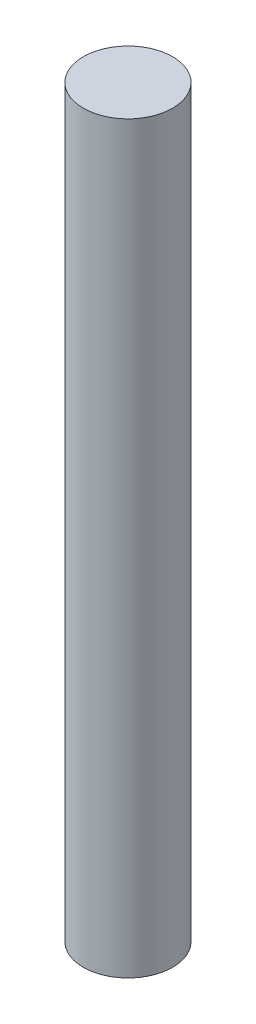
ISO-10303-21;
HEADER;
FILE_DESCRIPTION(('STEP AP214'),'2;1');
FILE_NAME('part.step','',(''),(''),'','','');
FILE_SCHEMA(('AUTOMOTIVE_DESIGN { 1 0 10303 214 1 1 1 1 }'));
ENDSEC;
DATA;
#1=APPLICATION_CONTEXT('core data for automotive mechanical design processes');
#2=APPLICATION_PROTOCOL_DEFINITION('international standard','automotive_design',2000,#1);
#3=PRODUCT_CONTEXT('',#1,'mechanical');
#4=PRODUCT('Part','Part','',(#3));
#5=PRODUCT_RELATED_PRODUCT_CATEGORY('part','',(#4));
#6=PRODUCT_DEFINITION_FORMATION('','',#4);
#7=PRODUCT_DEFINITION_CONTEXT('part definition',#1,'design');
#8=PRODUCT_DEFINITION('design','',#6,#7);
#9=PRODUCT_DEFINITION_SHAPE('','',#8);
#10=(LENGTH_UNIT() NAMED_UNIT(*) SI_UNIT(.MILLI.,.METRE.));
#11=(NAMED_UNIT(*) PLANE_ANGLE_UNIT() SI_UNIT($,.RADIAN.));
#12=(NAMED_UNIT(*) SI_UNIT($,.STERADIAN.) SOLID_ANGLE_UNIT());
#13=UNCERTAINTY_MEASURE_WITH_UNIT(LENGTH_MEASURE(1.E-05),#10,'distance_accuracy_value','');
#14=(GEOMETRIC_REPRESENTATION_CONTEXT(3) GLOBAL_UNCERTAINTY_ASSIGNED_CONTEXT((#13)) GLOBAL_UNIT_ASSIGNED_CONTEXT((#10,
#11,#12)) REPRESENTATION_CONTEXT('',''));
#15=CARTESIAN_POINT('',(0.,0.,0.));
#16=DIRECTION('',(0.,0.,1.));
#17=DIRECTION('',(1.,0.,0.));
#18=AXIS2_PLACEMENT_3D('',#15,#16,#17);
#19=CARTESIAN_POINT('',(0.,50.,0.));
#20=DIRECTION('',(0.,-1.,0.));
#21=DIRECTION('',(0.,0.,-1.));
#22=AXIS2_PLACEMENT_3D('',#19,#20,#21);
#23=CYLINDRICAL_SURFACE('',#22,3.);
#24=CARTESIAN_POINT('',(0.,50.,0.));
#25=DIRECTION('',(0.,1.,0.));
#26=DIRECTION('',(0.,0.,1.));
#27=AXIS2_PLACEMENT_3D('',#24,#25,#26);
#28=CIRCLE('',#27,3.);
#29=CARTESIAN_POINT('',(0.,50.,3.));
#30=VERTEX_POINT('',#29);
#31=EDGE_CURVE('E10',#30,#30,#28,.T.);
#32=ORIENTED_EDGE('',*,*,#31,.F.);
#33=EDGE_LOOP('',(#32));
#34=FACE_BOUND('',#33,.T.);
#35=CARTESIAN_POINT('',(0.,0.,0.));
#36=DIRECTION('',(0.,1.,0.));
#37=DIRECTION('',(0.,0.,1.));
#38=AXIS2_PLACEMENT_3D('',#35,#36,#37);
#39=CIRCLE('',#38,3.);
#40=CARTESIAN_POINT('',(0.,0.,3.));
#41=VERTEX_POINT('',#40);
#42=EDGE_CURVE('E40',#41,#41,#39,.T.);
#43=ORIENTED_EDGE('',*,*,#42,.T.);
#44=EDGE_LOOP('',(#43));
#45=FACE_BOUND('',#44,.T.);
#46=ADVANCED_FACE('F37',(#34,#45),#23,.T.);
#47=CARTESIAN_POINT('',(0.,50.,0.));
#48=DIRECTION('',(0.,1.,0.));
#49=DIRECTION('',(0.,0.,1.));
#50=AXIS2_PLACEMENT_3D('',#47,#48,#49);
#51=PLANE('',#50);
#52=ORIENTED_EDGE('',*,*,#31,.T.);
#53=EDGE_LOOP('',(#52));
#54=FACE_BOUND('',#53,.T.);
#55=ADVANCED_FACE('F54',(#54),#51,.T.);
#56=CARTESIAN_POINT('',(0.,0.,0.));
#57=DIRECTION('',(0.,1.,0.));
#58=DIRECTION('',(0.,0.,1.));
#59=AXIS2_PLACEMENT_3D('',#56,#57,#58);
#60=PLANE('',#59);
#61=ORIENTED_EDGE('',*,*,#42,.F.);
#62=EDGE_LOOP('',(#61));
#63=FACE_BOUND('',#62,.T.);
#64=ADVANCED_FACE('F52',(#63),#60,.F.);
#65=CLOSED_SHELL('',(#46,#55,#64));
#66=MANIFOLD_SOLID_BREP('B2',#65);
#67=ADVANCED_BREP_SHAPE_REPRESENTATION('',(#18,#66),#14);
#68=SHAPE_DEFINITION_REPRESENTATION(#9,#67);
ENDSEC;
END-ISO-10303-21;
